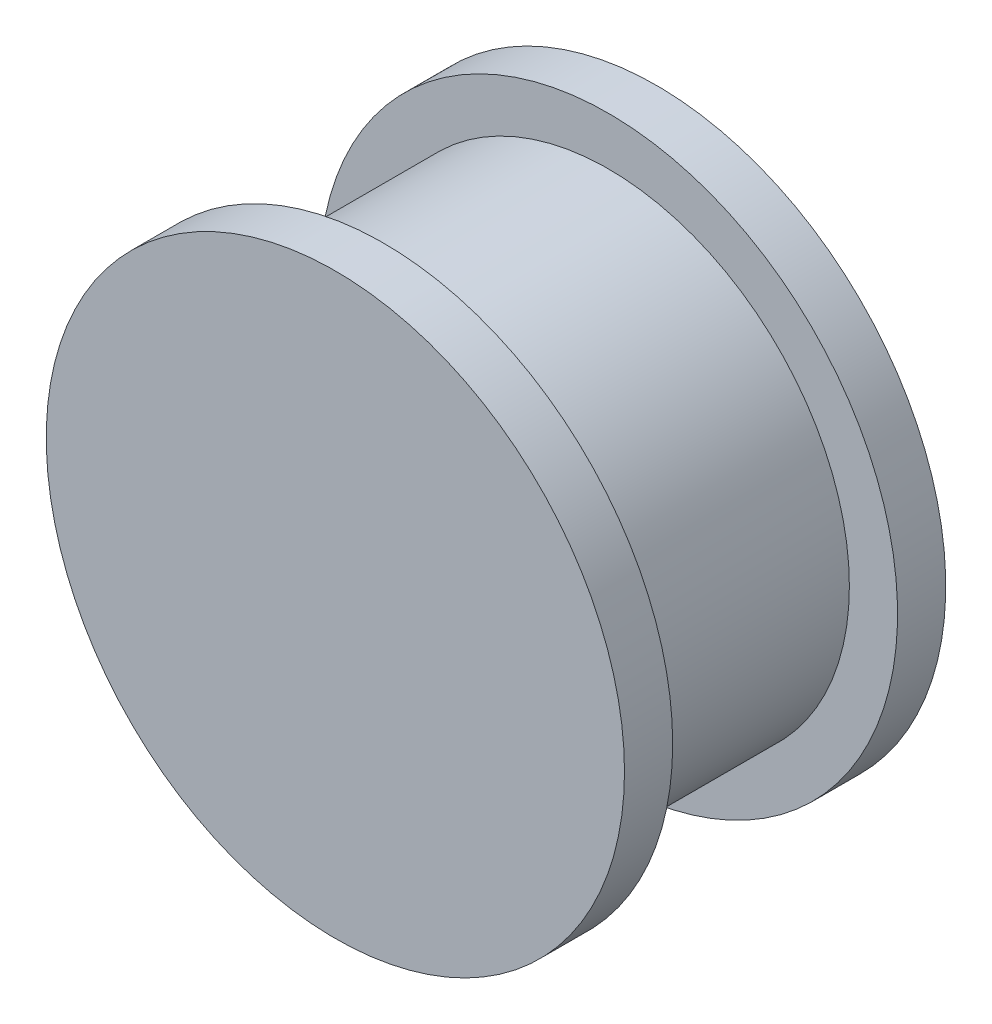
ISO-10303-21;
HEADER;
FILE_DESCRIPTION(('STEP AP214'),'2;1');
FILE_NAME('part.step','',(''),(''),'','','');
FILE_SCHEMA(('AUTOMOTIVE_DESIGN { 1 0 10303 214 1 1 1 1 }'));
ENDSEC;
DATA;
#1=APPLICATION_CONTEXT('core data for automotive mechanical design processes');
#2=APPLICATION_PROTOCOL_DEFINITION('international standard','automotive_design',2000,#1);
#3=PRODUCT_CONTEXT('',#1,'mechanical');
#4=PRODUCT('Part','Part','',(#3));
#5=PRODUCT_RELATED_PRODUCT_CATEGORY('part','',(#4));
#6=PRODUCT_DEFINITION_FORMATION('','',#4);
#7=PRODUCT_DEFINITION_CONTEXT('part definition',#1,'design');
#8=PRODUCT_DEFINITION('design','',#6,#7);
#9=PRODUCT_DEFINITION_SHAPE('','',#8);
#10=(LENGTH_UNIT() NAMED_UNIT(*) SI_UNIT(.MILLI.,.METRE.));
#11=(NAMED_UNIT(*) PLANE_ANGLE_UNIT() SI_UNIT($,.RADIAN.));
#12=(NAMED_UNIT(*) SI_UNIT($,.STERADIAN.) SOLID_ANGLE_UNIT());
#13=UNCERTAINTY_MEASURE_WITH_UNIT(LENGTH_MEASURE(1.E-05),#10,'distance_accuracy_value','');
#14=(GEOMETRIC_REPRESENTATION_CONTEXT(3) GLOBAL_UNCERTAINTY_ASSIGNED_CONTEXT((#13)) GLOBAL_UNIT_ASSIGNED_CONTEXT((#10,
#11,#12)) REPRESENTATION_CONTEXT('',''));
#15=CARTESIAN_POINT('',(0.,0.,0.));
#16=DIRECTION('',(0.,0.,1.));
#17=DIRECTION('',(1.,0.,0.));
#18=AXIS2_PLACEMENT_3D('',#15,#16,#17);
#19=CARTESIAN_POINT('',(0.,0.,-1.5));
#20=DIRECTION('',(0.,0.,-1.));
#21=DIRECTION('',(-1.,0.,0.));
#22=AXIS2_PLACEMENT_3D('',#19,#20,#21);
#23=PLANE('',#22);
#24=CARTESIAN_POINT('',(0.,0.,-1.5));
#25=DIRECTION('',(0.,0.,-1.));
#26=DIRECTION('',(-1.,0.,0.));
#27=AXIS2_PLACEMENT_3D('',#24,#25,#26);
#28=CIRCLE('',#27,9.);
#29=CARTESIAN_POINT('',(-9.,0.,-1.5));
#30=VERTEX_POINT('',#29);
#31=EDGE_CURVE('E11',#30,#30,#28,.T.);
#32=ORIENTED_EDGE('',*,*,#31,.T.);
#33=EDGE_LOOP('',(#32));
#34=FACE_BOUND('',#33,.T.);
#35=CARTESIAN_POINT('',(0.,0.,-1.5));
#36=DIRECTION('',(0.,0.,-1.));
#37=DIRECTION('',(-1.,0.,0.));
#38=AXIS2_PLACEMENT_3D('',#35,#36,#37);
#39=CIRCLE('',#38,6.5);
#40=CARTESIAN_POINT('',(-6.5,0.,-1.5));
#41=VERTEX_POINT('',#40);
#42=EDGE_CURVE('E50',#41,#41,#39,.T.);
#43=ORIENTED_EDGE('',*,*,#42,.F.);
#44=EDGE_LOOP('',(#43));
#45=FACE_BOUND('',#44,.T.);
#46=ADVANCED_FACE('F39',(#34,#45),#23,.T.);
#47=CARTESIAN_POINT('',(0.,0.,0.));
#48=DIRECTION('',(0.,0.,-1.));
#49=DIRECTION('',(-1.,0.,0.));
#50=AXIS2_PLACEMENT_3D('',#47,#48,#49);
#51=PLANE('',#50);
#52=CARTESIAN_POINT('',(0.,0.,0.));
#53=DIRECTION('',(0.,0.,-1.));
#54=DIRECTION('',(-1.,0.,0.));
#55=AXIS2_PLACEMENT_3D('',#52,#53,#54);
#56=CIRCLE('',#55,9.);
#57=CARTESIAN_POINT('',(-9.,0.,0.));
#58=VERTEX_POINT('',#57);
#59=EDGE_CURVE('E43',#58,#58,#56,.T.);
#60=ORIENTED_EDGE('',*,*,#59,.F.);
#61=EDGE_LOOP('',(#60));
#62=FACE_BOUND('',#61,.T.);
#63=CARTESIAN_POINT('',(0.,0.,0.));
#64=DIRECTION('',(0.,0.,-1.));
#65=DIRECTION('',(-1.,0.,0.));
#66=AXIS2_PLACEMENT_3D('',#63,#64,#65);
#67=CIRCLE('',#66,6.5);
#68=CARTESIAN_POINT('',(-6.5,0.,0.));
#69=VERTEX_POINT('',#68);
#70=EDGE_CURVE('E52',#69,#69,#67,.T.);
#71=ORIENTED_EDGE('',*,*,#70,.T.);
#72=EDGE_LOOP('',(#71));
#73=FACE_BOUND('',#72,.T.);
#74=ADVANCED_FACE('F62',(#62,#73),#51,.F.);
#75=CARTESIAN_POINT('',(0.,0.,-1.5));
#76=DIRECTION('',(0.,0.,1.));
#77=DIRECTION('',(1.,0.,0.));
#78=AXIS2_PLACEMENT_3D('',#75,#76,#77);
#79=CYLINDRICAL_SURFACE('',#78,9.);
#80=ORIENTED_EDGE('',*,*,#31,.F.);
#81=EDGE_LOOP('',(#80));
#82=FACE_BOUND('',#81,.T.);
#83=ORIENTED_EDGE('',*,*,#59,.T.);
#84=EDGE_LOOP('',(#83));
#85=FACE_BOUND('',#84,.T.);
#86=ADVANCED_FACE('F41',(#82,#85),#79,.T.);
#87=CARTESIAN_POINT('',(0.,0.,-1.5));
#88=DIRECTION('',(0.,0.,1.));
#89=DIRECTION('',(1.,0.,0.));
#90=AXIS2_PLACEMENT_3D('',#87,#88,#89);
#91=CYLINDRICAL_SURFACE('',#90,6.5);
#92=ORIENTED_EDGE('',*,*,#42,.T.);
#93=EDGE_LOOP('',(#92));
#94=FACE_BOUND('',#93,.T.);
#95=ORIENTED_EDGE('',*,*,#70,.F.);
#96=EDGE_LOOP('',(#95));
#97=FACE_BOUND('',#96,.T.);
#98=ADVANCED_FACE('F58',(#94,#97),#91,.F.);
#99=CLOSED_SHELL('',(#46,#74,#86,#98));
#100=MANIFOLD_SOLID_BREP('B2',#99);
#101=CARTESIAN_POINT('',(0.,0.,0.));
#102=DIRECTION('',(0.,0.,1.));
#103=DIRECTION('',(1.,0.,0.));
#104=AXIS2_PLACEMENT_3D('',#101,#102,#103);
#105=PLANE('',#104);
#106=CARTESIAN_POINT('',(0.,0.,0.));
#107=DIRECTION('',(0.,0.,1.));
#108=DIRECTION('',(1.,0.,0.));
#109=AXIS2_PLACEMENT_3D('',#106,#107,#108);
#110=CIRCLE('',#109,7.5);
#111=CARTESIAN_POINT('',(7.5,0.,0.));
#112=VERTEX_POINT('',#111);
#113=EDGE_CURVE('E105',#112,#112,#110,.T.);
#114=ORIENTED_EDGE('',*,*,#113,.F.);
#115=EDGE_LOOP('',(#114));
#116=FACE_BOUND('',#115,.T.);
#117=CARTESIAN_POINT('',(0.,0.,0.));
#118=DIRECTION('',(0.,0.,1.));
#119=DIRECTION('',(1.,0.,0.));
#120=AXIS2_PLACEMENT_3D('',#117,#118,#119);
#121=CIRCLE('',#120,6.5);
#122=CARTESIAN_POINT('',(6.5,0.,0.));
#123=VERTEX_POINT('',#122);
#124=EDGE_CURVE('E112',#123,#123,#121,.T.);
#125=ORIENTED_EDGE('',*,*,#124,.T.);
#126=EDGE_LOOP('',(#125));
#127=FACE_BOUND('',#126,.T.);
#128=ADVANCED_FACE('F101',(#116,#127),#105,.F.);
#129=CARTESIAN_POINT('',(0.,0.,7.));
#130=DIRECTION('',(0.,0.,-1.));
#131=DIRECTION('',(-1.,0.,0.));
#132=AXIS2_PLACEMENT_3D('',#129,#130,#131);
#133=CYLINDRICAL_SURFACE('',#132,7.5);
#134=CARTESIAN_POINT('',(0.,0.,7.));
#135=DIRECTION('',(0.,0.,1.));
#136=DIRECTION('',(1.,0.,0.));
#137=AXIS2_PLACEMENT_3D('',#134,#135,#136);
#138=CIRCLE('',#137,7.5);
#139=CARTESIAN_POINT('',(7.5,0.,7.));
#140=VERTEX_POINT('',#139);
#141=EDGE_CURVE('E38',#140,#140,#138,.T.);
#142=ORIENTED_EDGE('',*,*,#141,.F.);
#143=EDGE_LOOP('',(#142));
#144=FACE_BOUND('',#143,.T.);
#145=ORIENTED_EDGE('',*,*,#113,.T.);
#146=EDGE_LOOP('',(#145));
#147=FACE_BOUND('',#146,.T.);
#148=ADVANCED_FACE('F103',(#144,#147),#133,.T.);
#149=CARTESIAN_POINT('',(0.,0.,7.));
#150=DIRECTION('',(0.,0.,-1.));
#151=DIRECTION('',(-1.,0.,0.));
#152=AXIS2_PLACEMENT_3D('',#149,#150,#151);
#153=CYLINDRICAL_SURFACE('',#152,6.5);
#154=CARTESIAN_POINT('',(0.,0.,7.));
#155=DIRECTION('',(0.,0.,1.));
#156=DIRECTION('',(1.,0.,0.));
#157=AXIS2_PLACEMENT_3D('',#154,#155,#156);
#158=CIRCLE('',#157,6.5);
#159=CARTESIAN_POINT('',(6.5,0.,7.));
#160=VERTEX_POINT('',#159);
#161=EDGE_CURVE('E116',#160,#160,#158,.T.);
#162=ORIENTED_EDGE('',*,*,#161,.T.);
#163=EDGE_LOOP('',(#162));
#164=FACE_BOUND('',#163,.T.);
#165=ORIENTED_EDGE('',*,*,#124,.F.);
#166=EDGE_LOOP('',(#165));
#167=FACE_BOUND('',#166,.T.);
#168=ADVANCED_FACE('F143',(#164,#167),#153,.F.);
#169=CARTESIAN_POINT('',(0.,0.,7.));
#170=DIRECTION('',(0.,0.,1.));
#171=DIRECTION('',(1.,0.,0.));
#172=AXIS2_PLACEMENT_3D('',#169,#170,#171);
#173=PLANE('',#172);
#174=ORIENTED_EDGE('',*,*,#161,.F.);
#175=EDGE_LOOP('',(#174));
#176=FACE_BOUND('',#175,.T.);
#177=ADVANCED_FACE('F131',(#176),#173,.F.);
#178=CARTESIAN_POINT('',(0.,0.,8.5));
#179=DIRECTION('',(0.,0.,-1.));
#180=DIRECTION('',(-1.,0.,0.));
#181=AXIS2_PLACEMENT_3D('',#178,#179,#180);
#182=CYLINDRICAL_SURFACE('',#181,9.);
#183=CARTESIAN_POINT('',(0.,0.,8.5));
#184=DIRECTION('',(0.,0.,1.));
#185=DIRECTION('',(1.,0.,0.));
#186=AXIS2_PLACEMENT_3D('',#183,#184,#185);
#187=CIRCLE('',#186,9.);
#188=CARTESIAN_POINT('',(9.,0.,8.5));
#189=VERTEX_POINT('',#188);
#190=EDGE_CURVE('E119',#189,#189,#187,.T.);
#191=ORIENTED_EDGE('',*,*,#190,.F.);
#192=EDGE_LOOP('',(#191));
#193=FACE_BOUND('',#192,.T.);
#194=CARTESIAN_POINT('',(0.,0.,7.));
#195=DIRECTION('',(0.,0.,1.));
#196=DIRECTION('',(1.,0.,0.));
#197=AXIS2_PLACEMENT_3D('',#194,#195,#196);
#198=CIRCLE('',#197,9.);
#199=CARTESIAN_POINT('',(9.,0.,7.));
#200=VERTEX_POINT('',#199);
#201=EDGE_CURVE('E120',#200,#200,#198,.T.);
#202=ORIENTED_EDGE('',*,*,#201,.T.);
#203=EDGE_LOOP('',(#202));
#204=FACE_BOUND('',#203,.T.);
#205=ADVANCED_FACE('F128',(#193,#204),#182,.T.);
#206=CARTESIAN_POINT('',(0.,0.,8.5));
#207=DIRECTION('',(0.,0.,1.));
#208=DIRECTION('',(1.,0.,0.));
#209=AXIS2_PLACEMENT_3D('',#206,#207,#208);
#210=PLANE('',#209);
#211=ORIENTED_EDGE('',*,*,#190,.T.);
#212=EDGE_LOOP('',(#211));
#213=FACE_BOUND('',#212,.T.);
#214=ADVANCED_FACE('F126',(#213),#210,.T.);
#215=ORIENTED_EDGE('',*,*,#141,.T.);
#216=EDGE_LOOP('',(#215));
#217=FACE_BOUND('',#216,.T.);
#218=ORIENTED_EDGE('',*,*,#201,.F.);
#219=EDGE_LOOP('',(#218));
#220=FACE_BOUND('',#219,.T.);
#221=ADVANCED_FACE('F135',(#217,#220),#173,.F.);
#222=CLOSED_SHELL('',(#128,#148,#168,#177,#205,#214,#221));
#223=MANIFOLD_SOLID_BREP('B6',#222);
#224=ADVANCED_BREP_SHAPE_REPRESENTATION('',(#18,#100,#223),#14);
#225=SHAPE_DEFINITION_REPRESENTATION(#9,#224);
ENDSEC;
END-ISO-10303-21;
